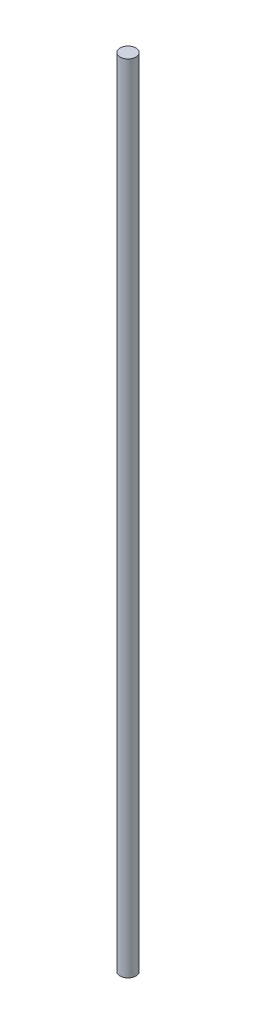
ISO-10303-21;
HEADER;
FILE_DESCRIPTION(('STEP AP214'),'2;1');
FILE_NAME('part.step','',(''),(''),'','','');
FILE_SCHEMA(('AUTOMOTIVE_DESIGN { 1 0 10303 214 1 1 1 1 }'));
ENDSEC;
DATA;
#1=APPLICATION_CONTEXT('core data for automotive mechanical design processes');
#2=APPLICATION_PROTOCOL_DEFINITION('international standard','automotive_design',2000,#1);
#3=PRODUCT_CONTEXT('',#1,'mechanical');
#4=PRODUCT('Part','Part','',(#3));
#5=PRODUCT_RELATED_PRODUCT_CATEGORY('part','',(#4));
#6=PRODUCT_DEFINITION_FORMATION('','',#4);
#7=PRODUCT_DEFINITION_CONTEXT('part definition',#1,'design');
#8=PRODUCT_DEFINITION('design','',#6,#7);
#9=PRODUCT_DEFINITION_SHAPE('','',#8);
#10=(LENGTH_UNIT() NAMED_UNIT(*) SI_UNIT(.MILLI.,.METRE.));
#11=(NAMED_UNIT(*) PLANE_ANGLE_UNIT() SI_UNIT($,.RADIAN.));
#12=(NAMED_UNIT(*) SI_UNIT($,.STERADIAN.) SOLID_ANGLE_UNIT());
#13=UNCERTAINTY_MEASURE_WITH_UNIT(LENGTH_MEASURE(1.E-05),#10,'distance_accuracy_value','');
#14=(GEOMETRIC_REPRESENTATION_CONTEXT(3) GLOBAL_UNCERTAINTY_ASSIGNED_CONTEXT((#13)) GLOBAL_UNIT_ASSIGNED_CONTEXT((#10,
#11,#12)) REPRESENTATION_CONTEXT('',''));
#15=CARTESIAN_POINT('',(0.,0.,0.));
#16=DIRECTION('',(0.,0.,1.));
#17=DIRECTION('',(1.,0.,0.));
#18=AXIS2_PLACEMENT_3D('',#15,#16,#17);
#19=CARTESIAN_POINT('',(0.,400.,0.));
#20=DIRECTION('',(0.,-1.,0.));
#21=DIRECTION('',(0.,0.,-1.));
#22=AXIS2_PLACEMENT_3D('',#19,#20,#21);
#23=CYLINDRICAL_SURFACE('',#22,4.);
#24=CARTESIAN_POINT('',(0.,400.,0.));
#25=DIRECTION('',(0.,1.,0.));
#26=DIRECTION('',(0.,0.,1.));
#27=AXIS2_PLACEMENT_3D('',#24,#25,#26);
#28=CIRCLE('',#27,4.);
#29=CARTESIAN_POINT('',(0.,400.,4.));
#30=VERTEX_POINT('',#29);
#31=EDGE_CURVE('E10',#30,#30,#28,.T.);
#32=ORIENTED_EDGE('',*,*,#31,.F.);
#33=EDGE_LOOP('',(#32));
#34=FACE_BOUND('',#33,.T.);
#35=CARTESIAN_POINT('',(0.,0.,0.));
#36=DIRECTION('',(0.,1.,0.));
#37=DIRECTION('',(0.,0.,1.));
#38=AXIS2_PLACEMENT_3D('',#35,#36,#37);
#39=CIRCLE('',#38,4.);
#40=CARTESIAN_POINT('',(0.,0.,4.));
#41=VERTEX_POINT('',#40);
#42=EDGE_CURVE('E44',#41,#41,#39,.T.);
#43=ORIENTED_EDGE('',*,*,#42,.T.);
#44=EDGE_LOOP('',(#43));
#45=FACE_BOUND('',#44,.T.);
#46=ADVANCED_FACE('F41',(#34,#45),#23,.T.);
#47=CARTESIAN_POINT('',(0.,400.,0.));
#48=DIRECTION('',(0.,1.,0.));
#49=DIRECTION('',(0.,0.,1.));
#50=AXIS2_PLACEMENT_3D('',#47,#48,#49);
#51=PLANE('',#50);
#52=ORIENTED_EDGE('',*,*,#31,.T.);
#53=EDGE_LOOP('',(#52));
#54=FACE_BOUND('',#53,.T.);
#55=ADVANCED_FACE('F58',(#54),#51,.T.);
#56=CARTESIAN_POINT('',(0.,0.,0.));
#57=DIRECTION('',(0.,1.,0.));
#58=DIRECTION('',(0.,0.,1.));
#59=AXIS2_PLACEMENT_3D('',#56,#57,#58);
#60=PLANE('',#59);
#61=ORIENTED_EDGE('',*,*,#42,.F.);
#62=EDGE_LOOP('',(#61));
#63=FACE_BOUND('',#62,.T.);
#64=ADVANCED_FACE('F56',(#63),#60,.F.);
#65=CLOSED_SHELL('',(#46,#55,#64));
#66=MANIFOLD_SOLID_BREP('B2',#65);
#67=ADVANCED_BREP_SHAPE_REPRESENTATION('',(#18,#66),#14);
#68=SHAPE_DEFINITION_REPRESENTATION(#9,#67);
ENDSEC;
END-ISO-10303-21;
